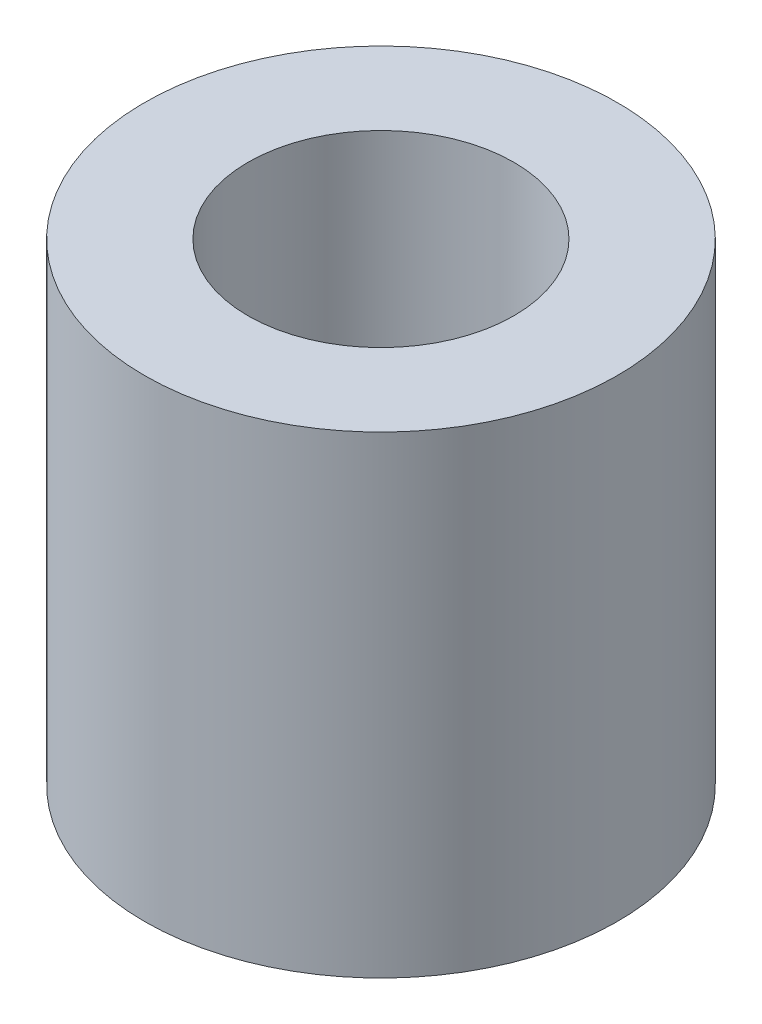
ISO-10303-21;
HEADER;
FILE_DESCRIPTION(('STEP AP214'),'2;1');
FILE_NAME('part.step','',(''),(''),'','','');
FILE_SCHEMA(('AUTOMOTIVE_DESIGN { 1 0 10303 214 1 1 1 1 }'));
ENDSEC;
DATA;
#1=APPLICATION_CONTEXT('core data for automotive mechanical design processes');
#2=APPLICATION_PROTOCOL_DEFINITION('international standard','automotive_design',2000,#1);
#3=PRODUCT_CONTEXT('',#1,'mechanical');
#4=PRODUCT('Part','Part','',(#3));
#5=PRODUCT_RELATED_PRODUCT_CATEGORY('part','',(#4));
#6=PRODUCT_DEFINITION_FORMATION('','',#4);
#7=PRODUCT_DEFINITION_CONTEXT('part definition',#1,'design');
#8=PRODUCT_DEFINITION('design','',#6,#7);
#9=PRODUCT_DEFINITION_SHAPE('','',#8);
#10=(LENGTH_UNIT() NAMED_UNIT(*) SI_UNIT(.MILLI.,.METRE.));
#11=(NAMED_UNIT(*) PLANE_ANGLE_UNIT() SI_UNIT($,.RADIAN.));
#12=(NAMED_UNIT(*) SI_UNIT($,.STERADIAN.) SOLID_ANGLE_UNIT());
#13=UNCERTAINTY_MEASURE_WITH_UNIT(LENGTH_MEASURE(1.E-05),#10,'distance_accuracy_value','');
#14=(GEOMETRIC_REPRESENTATION_CONTEXT(3) GLOBAL_UNCERTAINTY_ASSIGNED_CONTEXT((#13)) GLOBAL_UNIT_ASSIGNED_CONTEXT((#10,
#11,#12)) REPRESENTATION_CONTEXT('',''));
#15=CARTESIAN_POINT('',(0.,0.,0.));
#16=DIRECTION('',(0.,0.,1.));
#17=DIRECTION('',(1.,0.,0.));
#18=AXIS2_PLACEMENT_3D('',#15,#16,#17);
#19=CARTESIAN_POINT('',(0.,8.,0.));
#20=DIRECTION('',(0.,1.,0.));
#21=DIRECTION('',(0.,0.,1.));
#22=AXIS2_PLACEMENT_3D('',#19,#20,#21);
#23=PLANE('',#22);
#24=CARTESIAN_POINT('',(0.,8.,0.));
#25=DIRECTION('',(0.,1.,0.));
#26=DIRECTION('',(0.,0.,1.));
#27=AXIS2_PLACEMENT_3D('',#24,#25,#26);
#28=CIRCLE('',#27,4.);
#29=CARTESIAN_POINT('',(0.,8.,4.));
#30=VERTEX_POINT('',#29);
#31=EDGE_CURVE('E10',#30,#30,#28,.T.);
#32=ORIENTED_EDGE('',*,*,#31,.T.);
#33=EDGE_LOOP('',(#32));
#34=FACE_BOUND('',#33,.T.);
#35=CARTESIAN_POINT('',(0.,8.,0.));
#36=DIRECTION('',(0.,1.,0.));
#37=DIRECTION('',(0.,0.,1.));
#38=AXIS2_PLACEMENT_3D('',#35,#36,#37);
#39=CIRCLE('',#38,2.25);
#40=CARTESIAN_POINT('',(0.,8.,2.25));
#41=VERTEX_POINT('',#40);
#42=EDGE_CURVE('E42',#41,#41,#39,.T.);
#43=ORIENTED_EDGE('',*,*,#42,.F.);
#44=EDGE_LOOP('',(#43));
#45=FACE_BOUND('',#44,.T.);
#46=ADVANCED_FACE('F31',(#34,#45),#23,.T.);
#47=CARTESIAN_POINT('',(0.,0.,0.));
#48=DIRECTION('',(0.,1.,0.));
#49=DIRECTION('',(0.,0.,1.));
#50=AXIS2_PLACEMENT_3D('',#47,#48,#49);
#51=PLANE('',#50);
#52=CARTESIAN_POINT('',(0.,0.,0.));
#53=DIRECTION('',(0.,1.,0.));
#54=DIRECTION('',(0.,0.,1.));
#55=AXIS2_PLACEMENT_3D('',#52,#53,#54);
#56=CIRCLE('',#55,4.);
#57=CARTESIAN_POINT('',(0.,0.,4.));
#58=VERTEX_POINT('',#57);
#59=EDGE_CURVE('E35',#58,#58,#56,.T.);
#60=ORIENTED_EDGE('',*,*,#59,.F.);
#61=EDGE_LOOP('',(#60));
#62=FACE_BOUND('',#61,.T.);
#63=CARTESIAN_POINT('',(0.,0.,0.));
#64=DIRECTION('',(0.,1.,0.));
#65=DIRECTION('',(0.,0.,1.));
#66=AXIS2_PLACEMENT_3D('',#63,#64,#65);
#67=CIRCLE('',#66,2.25);
#68=CARTESIAN_POINT('',(0.,0.,2.25));
#69=VERTEX_POINT('',#68);
#70=EDGE_CURVE('E44',#69,#69,#67,.T.);
#71=ORIENTED_EDGE('',*,*,#70,.T.);
#72=EDGE_LOOP('',(#71));
#73=FACE_BOUND('',#72,.T.);
#74=ADVANCED_FACE('F54',(#62,#73),#51,.F.);
#75=CARTESIAN_POINT('',(0.,8.,0.));
#76=DIRECTION('',(0.,-1.,0.));
#77=DIRECTION('',(0.,0.,-1.));
#78=AXIS2_PLACEMENT_3D('',#75,#76,#77);
#79=CYLINDRICAL_SURFACE('',#78,4.);
#80=ORIENTED_EDGE('',*,*,#31,.F.);
#81=EDGE_LOOP('',(#80));
#82=FACE_BOUND('',#81,.T.);
#83=ORIENTED_EDGE('',*,*,#59,.T.);
#84=EDGE_LOOP('',(#83));
#85=FACE_BOUND('',#84,.T.);
#86=ADVANCED_FACE('F33',(#82,#85),#79,.T.);
#87=CARTESIAN_POINT('',(0.,8.,0.));
#88=DIRECTION('',(0.,-1.,0.));
#89=DIRECTION('',(0.,0.,-1.));
#90=AXIS2_PLACEMENT_3D('',#87,#88,#89);
#91=CYLINDRICAL_SURFACE('',#90,2.25);
#92=ORIENTED_EDGE('',*,*,#42,.T.);
#93=EDGE_LOOP('',(#92));
#94=FACE_BOUND('',#93,.T.);
#95=ORIENTED_EDGE('',*,*,#70,.F.);
#96=EDGE_LOOP('',(#95));
#97=FACE_BOUND('',#96,.T.);
#98=ADVANCED_FACE('F50',(#94,#97),#91,.F.);
#99=CLOSED_SHELL('',(#46,#74,#86,#98));
#100=MANIFOLD_SOLID_BREP('B2',#99);
#101=ADVANCED_BREP_SHAPE_REPRESENTATION('',(#18,#100),#14);
#102=SHAPE_DEFINITION_REPRESENTATION(#9,#101);
ENDSEC;
END-ISO-10303-21;
